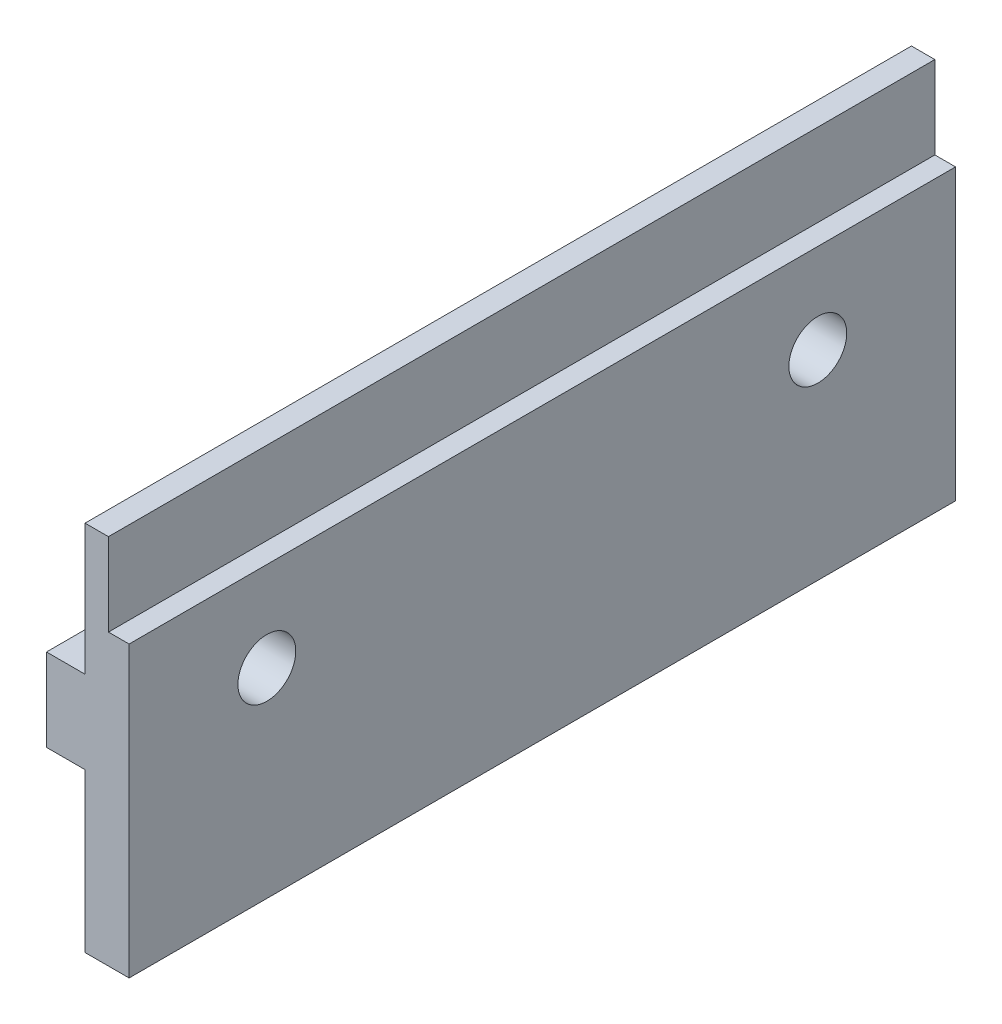
ISO-10303-21;
HEADER;
FILE_DESCRIPTION(('STEP AP214'),'2;1');
FILE_NAME('part.step','',(''),(''),'','','');
FILE_SCHEMA(('AUTOMOTIVE_DESIGN { 1 0 10303 214 1 1 1 1 }'));
ENDSEC;
DATA;
#1=APPLICATION_CONTEXT('core data for automotive mechanical design processes');
#2=APPLICATION_PROTOCOL_DEFINITION('international standard','automotive_design',2000,#1);
#3=PRODUCT_CONTEXT('',#1,'mechanical');
#4=PRODUCT('Part','Part','',(#3));
#5=PRODUCT_RELATED_PRODUCT_CATEGORY('part','',(#4));
#6=PRODUCT_DEFINITION_FORMATION('','',#4);
#7=PRODUCT_DEFINITION_CONTEXT('part definition',#1,'design');
#8=PRODUCT_DEFINITION('design','',#6,#7);
#9=PRODUCT_DEFINITION_SHAPE('','',#8);
#10=(LENGTH_UNIT() NAMED_UNIT(*) SI_UNIT(.MILLI.,.METRE.));
#11=(NAMED_UNIT(*) PLANE_ANGLE_UNIT() SI_UNIT($,.RADIAN.));
#12=(NAMED_UNIT(*) SI_UNIT($,.STERADIAN.) SOLID_ANGLE_UNIT());
#13=UNCERTAINTY_MEASURE_WITH_UNIT(LENGTH_MEASURE(1.E-05),#10,'distance_accuracy_value','');
#14=(GEOMETRIC_REPRESENTATION_CONTEXT(3) GLOBAL_UNCERTAINTY_ASSIGNED_CONTEXT((#13)) GLOBAL_UNIT_ASSIGNED_CONTEXT((#10,
#11,#12)) REPRESENTATION_CONTEXT('',''));
#15=CARTESIAN_POINT('',(0.,0.,0.));
#16=DIRECTION('',(0.,0.,1.));
#17=DIRECTION('',(1.,0.,0.));
#18=AXIS2_PLACEMENT_3D('',#15,#16,#17);
#19=CARTESIAN_POINT('',(6.,0.,0.));
#20=DIRECTION('',(0.,0.,-1.));
#21=DIRECTION('',(0.,1.,0.));
#22=AXIS2_PLACEMENT_3D('',#19,#20,#21);
#23=PLANE('',#22);
#24=DIRECTION('',(0.,-1.,0.));
#25=VECTOR('',#24,1.);
#26=CARTESIAN_POINT('',(2.8,0.,0.));
#27=LINE('',#26,#25);
#28=CARTESIAN_POINT('',(2.8,27.,0.));
#29=VERTEX_POINT('',#28);
#30=CARTESIAN_POINT('',(2.8,17.5,0.));
#31=VERTEX_POINT('',#30);
#32=EDGE_CURVE('E131',#29,#31,#27,.T.);
#33=ORIENTED_EDGE('',*,*,#32,.T.);
#34=DIRECTION('',(-1.,0.,0.));
#35=VECTOR('',#34,1.);
#36=CARTESIAN_POINT('',(6.,17.5,0.));
#37=LINE('',#36,#35);
#38=CARTESIAN_POINT('',(0.,17.5,0.));
#39=VERTEX_POINT('',#38);
#40=EDGE_CURVE('E255',#31,#39,#37,.T.);
#41=ORIENTED_EDGE('',*,*,#40,.T.);
#42=DIRECTION('',(0.,-1.,0.));
#43=VECTOR('',#42,1.);
#44=CARTESIAN_POINT('',(0.,0.,0.));
#45=LINE('',#44,#43);
#46=CARTESIAN_POINT('',(0.,11.5,0.));
#47=VERTEX_POINT('',#46);
#48=EDGE_CURVE('E73',#39,#47,#45,.T.);
#49=ORIENTED_EDGE('',*,*,#48,.T.);
#50=DIRECTION('',(1.,0.,0.));
#51=VECTOR('',#50,1.);
#52=CARTESIAN_POINT('',(6.,11.5,0.));
#53=LINE('',#52,#51);
#54=CARTESIAN_POINT('',(2.8,11.5,0.));
#55=VERTEX_POINT('',#54);
#56=EDGE_CURVE('E216',#47,#55,#53,.T.);
#57=ORIENTED_EDGE('',*,*,#56,.T.);
#58=DIRECTION('',(0.,-1.,0.));
#59=VECTOR('',#58,1.);
#60=CARTESIAN_POINT('',(2.8,0.,0.));
#61=LINE('',#60,#59);
#62=CARTESIAN_POINT('',(2.8,0.,0.));
#63=VERTEX_POINT('',#62);
#64=EDGE_CURVE('E220',#55,#63,#61,.T.);
#65=ORIENTED_EDGE('',*,*,#64,.T.);
#66=DIRECTION('',(-1.,0.,0.));
#67=VECTOR('',#66,1.);
#68=CARTESIAN_POINT('',(6.,0.,0.));
#69=LINE('',#68,#67);
#70=CARTESIAN_POINT('',(6.,0.,0.));
#71=VERTEX_POINT('',#70);
#72=EDGE_CURVE('E287',#71,#63,#69,.T.);
#73=ORIENTED_EDGE('',*,*,#72,.F.);
#74=DIRECTION('',(0.,-1.,0.));
#75=VECTOR('',#74,1.);
#76=CARTESIAN_POINT('',(6.,0.,0.));
#77=LINE('',#76,#75);
#78=CARTESIAN_POINT('',(6.,21.,0.));
#79=VERTEX_POINT('',#78);
#80=EDGE_CURVE('E273',#79,#71,#77,.T.);
#81=ORIENTED_EDGE('',*,*,#80,.F.);
#82=DIRECTION('',(1.,0.,0.));
#83=VECTOR('',#82,1.);
#84=CARTESIAN_POINT('',(6.,21.,0.));
#85=LINE('',#84,#83);
#86=CARTESIAN_POINT('',(4.5,21.,0.));
#87=VERTEX_POINT('',#86);
#88=EDGE_CURVE('E171',#79,#87,#85,.F.);
#89=ORIENTED_EDGE('',*,*,#88,.T.);
#90=DIRECTION('',(0.,1.,0.));
#91=VECTOR('',#90,1.);
#92=CARTESIAN_POINT('',(4.5,0.,0.));
#93=LINE('',#92,#91);
#94=CARTESIAN_POINT('',(4.5,27.,0.));
#95=VERTEX_POINT('',#94);
#96=EDGE_CURVE('E156',#87,#95,#93,.T.);
#97=ORIENTED_EDGE('',*,*,#96,.T.);
#98=DIRECTION('',(-1.,0.,0.));
#99=VECTOR('',#98,1.);
#100=CARTESIAN_POINT('',(6.,27.,0.));
#101=LINE('',#100,#99);
#102=EDGE_CURVE('E147',#95,#29,#101,.T.);
#103=ORIENTED_EDGE('',*,*,#102,.T.);
#104=EDGE_LOOP('',(#33,#41,#49,#57,#65,#73,#81,#89,#97,#103));
#105=FACE_BOUND('',#104,.T.);
#106=ADVANCED_FACE('F49',(#105),#23,.F.);
#107=CARTESIAN_POINT('',(6.,0.,0.));
#108=DIRECTION('',(0.,1.,0.));
#109=DIRECTION('',(0.,0.,1.));
#110=AXIS2_PLACEMENT_3D('',#107,#108,#109);
#111=PLANE('',#110);
#112=ORIENTED_EDGE('',*,*,#72,.T.);
#113=DIRECTION('',(0.,0.,-1.));
#114=VECTOR('',#113,1.);
#115=CARTESIAN_POINT('',(2.8,0.,2.50000000145967E-05));
#116=LINE('',#115,#114);
#117=CARTESIAN_POINT('',(2.8,0.,-60.));
#118=VERTEX_POINT('',#117);
#119=EDGE_CURVE('E221',#63,#118,#116,.T.);
#120=ORIENTED_EDGE('',*,*,#119,.T.);
#121=DIRECTION('',(-1.,0.,0.));
#122=VECTOR('',#121,1.);
#123=CARTESIAN_POINT('',(6.,0.,-60.));
#124=LINE('',#123,#122);
#125=CARTESIAN_POINT('',(6.,0.,-60.));
#126=VERTEX_POINT('',#125);
#127=EDGE_CURVE('E162',#126,#118,#124,.T.);
#128=ORIENTED_EDGE('',*,*,#127,.F.);
#129=DIRECTION('',(0.,0.,-1.));
#130=VECTOR('',#129,1.);
#131=CARTESIAN_POINT('',(6.,0.,0.));
#132=LINE('',#131,#130);
#133=EDGE_CURVE('E165',#71,#126,#132,.T.);
#134=ORIENTED_EDGE('',*,*,#133,.F.);
#135=EDGE_LOOP('',(#112,#120,#128,#134));
#136=FACE_BOUND('',#135,.T.);
#137=ADVANCED_FACE('F313',(#136),#111,.F.);
#138=CARTESIAN_POINT('',(6.,0.,-60.));
#139=DIRECTION('',(0.,0.,1.));
#140=DIRECTION('',(0.,-1.,0.));
#141=AXIS2_PLACEMENT_3D('',#138,#139,#140);
#142=PLANE('',#141);
#143=DIRECTION('',(0.,1.,0.));
#144=VECTOR('',#143,1.);
#145=CARTESIAN_POINT('',(0.,0.,-60.));
#146=LINE('',#145,#144);
#147=CARTESIAN_POINT('',(0.,11.5,-60.));
#148=VERTEX_POINT('',#147);
#149=CARTESIAN_POINT('',(0.,17.5,-60.));
#150=VERTEX_POINT('',#149);
#151=EDGE_CURVE('E268',#148,#150,#146,.T.);
#152=ORIENTED_EDGE('',*,*,#151,.T.);
#153=DIRECTION('',(1.,0.,0.));
#154=VECTOR('',#153,1.);
#155=CARTESIAN_POINT('',(6.,17.5,-60.));
#156=LINE('',#155,#154);
#157=CARTESIAN_POINT('',(2.8,17.5,-60.));
#158=VERTEX_POINT('',#157);
#159=EDGE_CURVE('E65',#150,#158,#156,.T.);
#160=ORIENTED_EDGE('',*,*,#159,.T.);
#161=DIRECTION('',(0.,1.,0.));
#162=VECTOR('',#161,1.);
#163=CARTESIAN_POINT('',(2.8,0.,-60.));
#164=LINE('',#163,#162);
#165=CARTESIAN_POINT('',(2.8,27.,-60.));
#166=VERTEX_POINT('',#165);
#167=EDGE_CURVE('E140',#158,#166,#164,.T.);
#168=ORIENTED_EDGE('',*,*,#167,.T.);
#169=DIRECTION('',(-1.,0.,0.));
#170=VECTOR('',#169,1.);
#171=CARTESIAN_POINT('',(6.,27.,-60.));
#172=LINE('',#171,#170);
#173=CARTESIAN_POINT('',(4.5,27.,-60.));
#174=VERTEX_POINT('',#173);
#175=EDGE_CURVE('E149',#174,#166,#172,.T.);
#176=ORIENTED_EDGE('',*,*,#175,.F.);
#177=DIRECTION('',(0.,1.,0.));
#178=VECTOR('',#177,1.);
#179=CARTESIAN_POINT('',(4.5,27.,-60.));
#180=LINE('',#179,#178);
#181=CARTESIAN_POINT('',(4.5,21.,-60.));
#182=VERTEX_POINT('',#181);
#183=EDGE_CURVE('E249',#182,#174,#180,.T.);
#184=ORIENTED_EDGE('',*,*,#183,.F.);
#185=DIRECTION('',(-1.,0.,0.));
#186=VECTOR('',#185,1.);
#187=CARTESIAN_POINT('',(6.,21.,-60.));
#188=LINE('',#187,#186);
#189=CARTESIAN_POINT('',(6.,21.,-60.));
#190=VERTEX_POINT('',#189);
#191=EDGE_CURVE('E229',#190,#182,#188,.T.);
#192=ORIENTED_EDGE('',*,*,#191,.F.);
#193=DIRECTION('',(0.,1.,0.));
#194=VECTOR('',#193,1.);
#195=CARTESIAN_POINT('',(6.,0.,-60.));
#196=LINE('',#195,#194);
#197=EDGE_CURVE('E158',#126,#190,#196,.T.);
#198=ORIENTED_EDGE('',*,*,#197,.F.);
#199=ORIENTED_EDGE('',*,*,#127,.T.);
#200=DIRECTION('',(0.,-1.,0.));
#201=VECTOR('',#200,1.);
#202=CARTESIAN_POINT('',(2.8,0.,-60.));
#203=LINE('',#202,#201);
#204=CARTESIAN_POINT('',(2.8,11.5,-60.));
#205=VERTEX_POINT('',#204);
#206=EDGE_CURVE('E206',#205,#118,#203,.T.);
#207=ORIENTED_EDGE('',*,*,#206,.F.);
#208=DIRECTION('',(1.,0.,0.));
#209=VECTOR('',#208,1.);
#210=CARTESIAN_POINT('',(0.,11.5,-60.));
#211=LINE('',#210,#209);
#212=EDGE_CURVE('E139',#148,#205,#211,.T.);
#213=ORIENTED_EDGE('',*,*,#212,.F.);
#214=EDGE_LOOP('',(#152,#160,#168,#176,#184,#192,#198,#199,#207,#213));
#215=FACE_BOUND('',#214,.T.);
#216=ADVANCED_FACE('F265',(#215),#142,.F.);
#217=CARTESIAN_POINT('',(6.,27.,0.));
#218=DIRECTION('',(0.,-1.,0.));
#219=DIRECTION('',(0.,0.,-1.));
#220=AXIS2_PLACEMENT_3D('',#217,#218,#219);
#221=PLANE('',#220);
#222=ORIENTED_EDGE('',*,*,#175,.T.);
#223=DIRECTION('',(0.,0.,-1.));
#224=VECTOR('',#223,1.);
#225=CARTESIAN_POINT('',(2.8,27.,2.50000000284745E-05));
#226=LINE('',#225,#224);
#227=EDGE_CURVE('E134',#29,#166,#226,.T.);
#228=ORIENTED_EDGE('',*,*,#227,.F.);
#229=ORIENTED_EDGE('',*,*,#102,.F.);
#230=DIRECTION('',(0.,0.,-1.));
#231=VECTOR('',#230,1.);
#232=CARTESIAN_POINT('',(4.5,27.,0.));
#233=LINE('',#232,#231);
#234=EDGE_CURVE('E228',#95,#174,#233,.T.);
#235=ORIENTED_EDGE('',*,*,#234,.T.);
#236=EDGE_LOOP('',(#222,#228,#229,#235));
#237=FACE_BOUND('',#236,.T.);
#238=ADVANCED_FACE('F145',(#237),#221,.F.);
#239=CARTESIAN_POINT('',(6.,0.,0.));
#240=DIRECTION('',(-1.,0.,0.));
#241=DIRECTION('',(0.,0.,1.));
#242=AXIS2_PLACEMENT_3D('',#239,#240,#241);
#243=PLANE('',#242);
#244=CARTESIAN_POINT('',(6.,14.5,-9.99999999999999));
#245=DIRECTION('',(-1.,0.,0.));
#246=DIRECTION('',(0.,0.,1.));
#247=AXIS2_PLACEMENT_3D('',#244,#245,#246);
#248=CIRCLE('',#247,2.09999999999999);
#249=CARTESIAN_POINT('',(6.,14.5,-7.9));
#250=VERTEX_POINT('',#249);
#251=EDGE_CURVE('E52',#250,#250,#248,.T.);
#252=ORIENTED_EDGE('',*,*,#251,.T.);
#253=EDGE_LOOP('',(#252));
#254=FACE_BOUND('',#253,.T.);
#255=CARTESIAN_POINT('',(6.,14.5,-50.));
#256=DIRECTION('',(-1.,0.,0.));
#257=DIRECTION('',(0.,0.,1.));
#258=AXIS2_PLACEMENT_3D('',#255,#256,#257);
#259=CIRCLE('',#258,2.1);
#260=CARTESIAN_POINT('',(6.,14.5,-47.9));
#261=VERTEX_POINT('',#260);
#262=EDGE_CURVE('E151',#261,#261,#259,.T.);
#263=ORIENTED_EDGE('',*,*,#262,.T.);
#264=EDGE_LOOP('',(#263));
#265=FACE_BOUND('',#264,.T.);
#266=ORIENTED_EDGE('',*,*,#197,.T.);
#267=DIRECTION('',(0.,0.,1.));
#268=VECTOR('',#267,1.);
#269=CARTESIAN_POINT('',(6.,21.,0.));
#270=LINE('',#269,#268);
#271=EDGE_CURVE('E291',#190,#79,#270,.T.);
#272=ORIENTED_EDGE('',*,*,#271,.T.);
#273=ORIENTED_EDGE('',*,*,#80,.T.);
#274=ORIENTED_EDGE('',*,*,#133,.T.);
#275=EDGE_LOOP('',(#266,#272,#273,#274));
#276=FACE_BOUND('',#275,.T.);
#277=ADVANCED_FACE('F305',(#254,#265,#276),#243,.F.);
#278=CARTESIAN_POINT('',(0.,0.,0.));
#279=DIRECTION('',(-1.,0.,0.));
#280=DIRECTION('',(0.,0.,1.));
#281=AXIS2_PLACEMENT_3D('',#278,#279,#280);
#282=PLANE('',#281);
#283=CARTESIAN_POINT('',(0.,14.5,-9.99999999999999));
#284=DIRECTION('',(-1.,0.,0.));
#285=DIRECTION('',(0.,0.,1.));
#286=AXIS2_PLACEMENT_3D('',#283,#284,#285);
#287=CIRCLE('',#286,2.09999999999999);
#288=CARTESIAN_POINT('',(0.,14.5,-7.9));
#289=VERTEX_POINT('',#288);
#290=EDGE_CURVE('E526',#289,#289,#287,.T.);
#291=ORIENTED_EDGE('',*,*,#290,.F.);
#292=EDGE_LOOP('',(#291));
#293=FACE_BOUND('',#292,.T.);
#294=CARTESIAN_POINT('',(0.,14.5,-50.));
#295=DIRECTION('',(-1.,0.,0.));
#296=DIRECTION('',(0.,0.,1.));
#297=AXIS2_PLACEMENT_3D('',#294,#295,#296);
#298=CIRCLE('',#297,2.1);
#299=CARTESIAN_POINT('',(0.,14.5,-47.9));
#300=VERTEX_POINT('',#299);
#301=EDGE_CURVE('E185',#300,#300,#298,.T.);
#302=ORIENTED_EDGE('',*,*,#301,.F.);
#303=EDGE_LOOP('',(#302));
#304=FACE_BOUND('',#303,.T.);
#305=DIRECTION('',(0.,0.,1.));
#306=VECTOR('',#305,1.);
#307=CARTESIAN_POINT('',(0.,17.5,0.));
#308=LINE('',#307,#306);
#309=EDGE_CURVE('E13',#150,#39,#308,.T.);
#310=ORIENTED_EDGE('',*,*,#309,.F.);
#311=ORIENTED_EDGE('',*,*,#151,.F.);
#312=DIRECTION('',(0.,0.,-1.));
#313=VECTOR('',#312,1.);
#314=CARTESIAN_POINT('',(0.,11.5,0.));
#315=LINE('',#314,#313);
#316=EDGE_CURVE('E59',#47,#148,#315,.T.);
#317=ORIENTED_EDGE('',*,*,#316,.F.);
#318=ORIENTED_EDGE('',*,*,#48,.F.);
#319=EDGE_LOOP('',(#310,#311,#317,#318));
#320=FACE_BOUND('',#319,.T.);
#321=ADVANCED_FACE('F338',(#293,#304,#320),#282,.T.);
#322=CARTESIAN_POINT('',(4.5,27.,0.));
#323=DIRECTION('',(-1.,0.,0.));
#324=DIRECTION('',(0.,0.,1.));
#325=AXIS2_PLACEMENT_3D('',#322,#323,#324);
#326=PLANE('',#325);
#327=DIRECTION('',(0.,0.,-1.));
#328=VECTOR('',#327,1.);
#329=CARTESIAN_POINT('',(4.5,21.,0.));
#330=LINE('',#329,#328);
#331=EDGE_CURVE('E233',#87,#182,#330,.T.);
#332=ORIENTED_EDGE('',*,*,#331,.T.);
#333=ORIENTED_EDGE('',*,*,#183,.T.);
#334=ORIENTED_EDGE('',*,*,#234,.F.);
#335=ORIENTED_EDGE('',*,*,#96,.F.);
#336=EDGE_LOOP('',(#332,#333,#334,#335));
#337=FACE_BOUND('',#336,.T.);
#338=ADVANCED_FACE('F364',(#337),#326,.F.);
#339=CARTESIAN_POINT('',(6.,21.,0.));
#340=DIRECTION('',(0.,-1.,0.));
#341=DIRECTION('',(0.,0.,-1.));
#342=AXIS2_PLACEMENT_3D('',#339,#340,#341);
#343=PLANE('',#342);
#344=ORIENTED_EDGE('',*,*,#271,.F.);
#345=ORIENTED_EDGE('',*,*,#191,.T.);
#346=ORIENTED_EDGE('',*,*,#331,.F.);
#347=ORIENTED_EDGE('',*,*,#88,.F.);
#348=EDGE_LOOP('',(#344,#345,#346,#347));
#349=FACE_BOUND('',#348,.T.);
#350=ADVANCED_FACE('F318',(#349),#343,.F.);
#351=CARTESIAN_POINT('',(2.8,0.,2.50000000145967E-05));
#352=DIRECTION('',(1.,0.,0.));
#353=DIRECTION('',(0.,0.,-1.));
#354=AXIS2_PLACEMENT_3D('',#351,#352,#353);
#355=PLANE('',#354);
#356=DIRECTION('',(0.,0.,-1.));
#357=VECTOR('',#356,1.);
#358=CARTESIAN_POINT('',(2.8,11.5,2.50000000215356E-05));
#359=LINE('',#358,#357);
#360=EDGE_CURVE('E222',#55,#205,#359,.T.);
#361=ORIENTED_EDGE('',*,*,#360,.T.);
#362=ORIENTED_EDGE('',*,*,#206,.T.);
#363=ORIENTED_EDGE('',*,*,#119,.F.);
#364=ORIENTED_EDGE('',*,*,#64,.F.);
#365=EDGE_LOOP('',(#361,#362,#363,#364));
#366=FACE_BOUND('',#365,.T.);
#367=ADVANCED_FACE('F336',(#366),#355,.F.);
#368=CARTESIAN_POINT('',(0.,11.5,2.50000000215356E-05));
#369=DIRECTION('',(0.,1.,0.));
#370=DIRECTION('',(0.,0.,1.));
#371=AXIS2_PLACEMENT_3D('',#368,#369,#370);
#372=PLANE('',#371);
#373=ORIENTED_EDGE('',*,*,#316,.T.);
#374=ORIENTED_EDGE('',*,*,#212,.T.);
#375=ORIENTED_EDGE('',*,*,#360,.F.);
#376=ORIENTED_EDGE('',*,*,#56,.F.);
#377=EDGE_LOOP('',(#373,#374,#375,#376));
#378=FACE_BOUND('',#377,.T.);
#379=ADVANCED_FACE('F337',(#378),#372,.F.);
#380=CARTESIAN_POINT('',(2.8,27.,2.50000000284745E-05));
#381=DIRECTION('',(1.,0.,0.));
#382=DIRECTION('',(0.,1.,0.));
#383=AXIS2_PLACEMENT_3D('',#380,#381,#382);
#384=PLANE('',#383);
#385=ORIENTED_EDGE('',*,*,#227,.T.);
#386=ORIENTED_EDGE('',*,*,#167,.F.);
#387=DIRECTION('',(0.,0.,-1.));
#388=VECTOR('',#387,1.);
#389=CARTESIAN_POINT('',(2.8,17.5,2.50000000215356E-05));
#390=LINE('',#389,#388);
#391=EDGE_CURVE('E136',#31,#158,#390,.T.);
#392=ORIENTED_EDGE('',*,*,#391,.F.);
#393=ORIENTED_EDGE('',*,*,#32,.F.);
#394=EDGE_LOOP('',(#385,#386,#392,#393));
#395=FACE_BOUND('',#394,.T.);
#396=ADVANCED_FACE('F133',(#395),#384,.F.);
#397=CARTESIAN_POINT('',(0.,17.5,2.50000000215356E-05));
#398=DIRECTION('',(0.,-1.,0.));
#399=DIRECTION('',(0.,0.,-1.));
#400=AXIS2_PLACEMENT_3D('',#397,#398,#399);
#401=PLANE('',#400);
#402=ORIENTED_EDGE('',*,*,#391,.T.);
#403=ORIENTED_EDGE('',*,*,#159,.F.);
#404=ORIENTED_EDGE('',*,*,#309,.T.);
#405=ORIENTED_EDGE('',*,*,#40,.F.);
#406=EDGE_LOOP('',(#402,#403,#404,#405));
#407=FACE_BOUND('',#406,.T.);
#408=ADVANCED_FACE('F339',(#407),#401,.F.);
#409=CARTESIAN_POINT('',(0.,14.5,-50.));
#410=DIRECTION('',(-1.,0.,0.));
#411=DIRECTION('',(0.,0.,1.));
#412=AXIS2_PLACEMENT_3D('',#409,#410,#411);
#413=CYLINDRICAL_SURFACE('',#412,2.1);
#414=ORIENTED_EDGE('',*,*,#301,.T.);
#415=EDGE_LOOP('',(#414));
#416=FACE_BOUND('',#415,.T.);
#417=ORIENTED_EDGE('',*,*,#262,.F.);
#418=EDGE_LOOP('',(#417));
#419=FACE_BOUND('',#418,.T.);
#420=ADVANCED_FACE('F341',(#416,#419),#413,.F.);
#421=CARTESIAN_POINT('',(0.,14.5,-9.99999999999999));
#422=DIRECTION('',(-1.,0.,0.));
#423=DIRECTION('',(0.,0.,1.));
#424=AXIS2_PLACEMENT_3D('',#421,#422,#423);
#425=CYLINDRICAL_SURFACE('',#424,2.09999999999999);
#426=ORIENTED_EDGE('',*,*,#290,.T.);
#427=EDGE_LOOP('',(#426));
#428=FACE_BOUND('',#427,.T.);
#429=ORIENTED_EDGE('',*,*,#251,.F.);
#430=EDGE_LOOP('',(#429));
#431=FACE_BOUND('',#430,.T.);
#432=ADVANCED_FACE('F347',(#428,#431),#425,.F.);
#433=CLOSED_SHELL('',(#106,#137,#216,#238,#277,#321,#338,#350,#367,#379,#396,#408,#420,#432));
#434=MANIFOLD_SOLID_BREP('B2',#433);
#435=ADVANCED_BREP_SHAPE_REPRESENTATION('',(#18,#434),#14);
#436=SHAPE_DEFINITION_REPRESENTATION(#9,#435);
ENDSEC;
END-ISO-10303-21;
